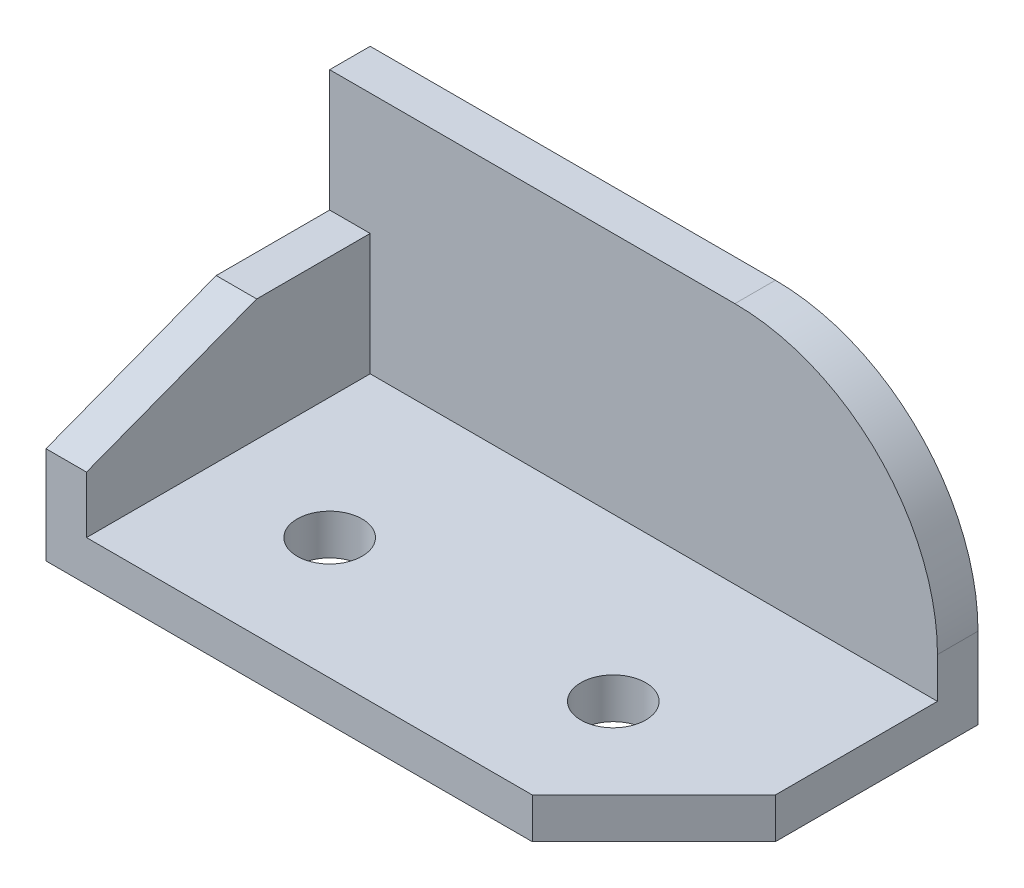
ISO-10303-21;
HEADER;
FILE_DESCRIPTION(('STEP AP214'),'2;1');
FILE_NAME('part.step','',(''),(''),'','','');
FILE_SCHEMA(('AUTOMOTIVE_DESIGN { 1 0 10303 214 1 1 1 1 }'));
ENDSEC;
DATA;
#1=APPLICATION_CONTEXT('core data for automotive mechanical design processes');
#2=APPLICATION_PROTOCOL_DEFINITION('international standard','automotive_design',2000,#1);
#3=PRODUCT_CONTEXT('',#1,'mechanical');
#4=PRODUCT('Part','Part','',(#3));
#5=PRODUCT_RELATED_PRODUCT_CATEGORY('part','',(#4));
#6=PRODUCT_DEFINITION_FORMATION('','',#4);
#7=PRODUCT_DEFINITION_CONTEXT('part definition',#1,'design');
#8=PRODUCT_DEFINITION('design','',#6,#7);
#9=PRODUCT_DEFINITION_SHAPE('','',#8);
#10=(LENGTH_UNIT() NAMED_UNIT(*) SI_UNIT(.MILLI.,.METRE.));
#11=(NAMED_UNIT(*) PLANE_ANGLE_UNIT() SI_UNIT($,.RADIAN.));
#12=(NAMED_UNIT(*) SI_UNIT($,.STERADIAN.) SOLID_ANGLE_UNIT());
#13=UNCERTAINTY_MEASURE_WITH_UNIT(LENGTH_MEASURE(1.E-05),#10,'distance_accuracy_value','');
#14=(GEOMETRIC_REPRESENTATION_CONTEXT(3) GLOBAL_UNCERTAINTY_ASSIGNED_CONTEXT((#13)) GLOBAL_UNIT_ASSIGNED_CONTEXT((#10,
#11,#12)) REPRESENTATION_CONTEXT('',''));
#15=CARTESIAN_POINT('',(0.,0.,0.));
#16=DIRECTION('',(0.,0.,1.));
#17=DIRECTION('',(1.,0.,0.));
#18=AXIS2_PLACEMENT_3D('',#15,#16,#17);
#19=CARTESIAN_POINT('',(75.,0.,5.));
#20=DIRECTION('',(0.,0.,-1.));
#21=DIRECTION('',(0.,1.,0.));
#22=AXIS2_PLACEMENT_3D('',#19,#20,#21);
#23=PLANE('',#22);
#24=DIRECTION('',(0.,-1.,0.));
#25=VECTOR('',#24,1.);
#26=CARTESIAN_POINT('',(75.,0.,5.));
#27=LINE('',#26,#25);
#28=CARTESIAN_POINT('',(75.,10.,5.));
#29=VERTEX_POINT('',#28);
#30=CARTESIAN_POINT('',(75.,5.,5.));
#31=VERTEX_POINT('',#30);
#32=EDGE_CURVE('E243',#29,#31,#27,.T.);
#33=ORIENTED_EDGE('',*,*,#32,.F.);
#34=CARTESIAN_POINT('',(50.,10.,5.));
#35=DIRECTION('',(0.,0.,-1.));
#36=DIRECTION('',(0.,1.,0.));
#37=AXIS2_PLACEMENT_3D('',#34,#35,#36);
#38=CIRCLE('',#37,25.);
#39=CARTESIAN_POINT('',(50.,35.,5.));
#40=VERTEX_POINT('',#39);
#41=EDGE_CURVE('E11',#29,#40,#38,.F.);
#42=ORIENTED_EDGE('',*,*,#41,.T.);
#43=DIRECTION('',(-1.,0.,0.));
#44=VECTOR('',#43,1.);
#45=CARTESIAN_POINT('',(75.,35.,5.));
#46=LINE('',#45,#44);
#47=CARTESIAN_POINT('',(0.,35.,5.));
#48=VERTEX_POINT('',#47);
#49=EDGE_CURVE('E193',#40,#48,#46,.T.);
#50=ORIENTED_EDGE('',*,*,#49,.T.);
#51=DIRECTION('',(0.,-1.,0.));
#52=VECTOR('',#51,1.);
#53=CARTESIAN_POINT('',(0.,0.,5.));
#54=LINE('',#53,#52);
#55=CARTESIAN_POINT('',(0.,20.,5.));
#56=VERTEX_POINT('',#55);
#57=EDGE_CURVE('E229',#48,#56,#54,.T.);
#58=ORIENTED_EDGE('',*,*,#57,.T.);
#59=DIRECTION('',(-1.,0.,0.));
#60=VECTOR('',#59,1.);
#61=CARTESIAN_POINT('',(5.,20.,5.));
#62=LINE('',#61,#60);
#63=CARTESIAN_POINT('',(5.,20.,5.));
#64=VERTEX_POINT('',#63);
#65=EDGE_CURVE('E151',#64,#56,#62,.T.);
#66=ORIENTED_EDGE('',*,*,#65,.F.);
#67=DIRECTION('',(0.,-1.,0.));
#68=VECTOR('',#67,1.);
#69=CARTESIAN_POINT('',(5.,0.,5.));
#70=LINE('',#69,#68);
#71=CARTESIAN_POINT('',(5.,5.,5.));
#72=VERTEX_POINT('',#71);
#73=EDGE_CURVE('E134',#64,#72,#70,.T.);
#74=ORIENTED_EDGE('',*,*,#73,.T.);
#75=DIRECTION('',(-1.,0.,0.));
#76=VECTOR('',#75,1.);
#77=CARTESIAN_POINT('',(75.,5.,5.));
#78=LINE('',#77,#76);
#79=EDGE_CURVE('E149',#31,#72,#78,.T.);
#80=ORIENTED_EDGE('',*,*,#79,.F.);
#81=EDGE_LOOP('',(#33,#42,#50,#58,#66,#74,#80));
#82=FACE_BOUND('',#81,.T.);
#83=ADVANCED_FACE('F47',(#82),#23,.F.);
#84=CARTESIAN_POINT('',(75.,5.,0.));
#85=DIRECTION('',(0.,-1.,0.));
#86=DIRECTION('',(0.,0.,-1.));
#87=AXIS2_PLACEMENT_3D('',#84,#85,#86);
#88=PLANE('',#87);
#89=CARTESIAN_POINT('',(20.,5.,25.));
#90=DIRECTION('',(0.,1.,0.));
#91=DIRECTION('',(0.,0.,1.));
#92=AXIS2_PLACEMENT_3D('',#89,#90,#91);
#93=CIRCLE('',#92,4.00000000000001);
#94=CARTESIAN_POINT('',(20.,5.,29.));
#95=VERTEX_POINT('',#94);
#96=EDGE_CURVE('E287',#95,#95,#93,.T.);
#97=ORIENTED_EDGE('',*,*,#96,.F.);
#98=EDGE_LOOP('',(#97));
#99=FACE_BOUND('',#98,.T.);
#100=CARTESIAN_POINT('',(55.,5.,25.));
#101=DIRECTION('',(0.,1.,0.));
#102=DIRECTION('',(0.,0.,1.));
#103=AXIS2_PLACEMENT_3D('',#100,#101,#102);
#104=CIRCLE('',#103,4.00000000000001);
#105=CARTESIAN_POINT('',(55.,5.,29.));
#106=VERTEX_POINT('',#105);
#107=EDGE_CURVE('E283',#106,#106,#104,.T.);
#108=ORIENTED_EDGE('',*,*,#107,.F.);
#109=EDGE_LOOP('',(#108));
#110=FACE_BOUND('',#109,.T.);
#111=DIRECTION('',(-1.,0.,0.));
#112=VECTOR('',#111,1.);
#113=CARTESIAN_POINT('',(75.,5.,40.));
#114=LINE('',#113,#112);
#115=CARTESIAN_POINT('',(60.,5.,40.));
#116=VERTEX_POINT('',#115);
#117=CARTESIAN_POINT('',(5.,5.,40.));
#118=VERTEX_POINT('',#117);
#119=EDGE_CURVE('E161',#116,#118,#114,.T.);
#120=ORIENTED_EDGE('',*,*,#119,.F.);
#121=DIRECTION('',(-0.707106781186548,0.,0.707106781186548));
#122=VECTOR('',#121,1.);
#123=CARTESIAN_POINT('',(60.,4.99999999999999,40.));
#124=LINE('',#123,#122);
#125=CARTESIAN_POINT('',(75.,5.,25.));
#126=VERTEX_POINT('',#125);
#127=EDGE_CURVE('E167',#116,#126,#124,.F.);
#128=ORIENTED_EDGE('',*,*,#127,.T.);
#129=DIRECTION('',(0.,0.,1.));
#130=VECTOR('',#129,1.);
#131=CARTESIAN_POINT('',(75.,5.,0.));
#132=LINE('',#131,#130);
#133=EDGE_CURVE('E158',#31,#126,#132,.T.);
#134=ORIENTED_EDGE('',*,*,#133,.F.);
#135=ORIENTED_EDGE('',*,*,#79,.T.);
#136=DIRECTION('',(0.,0.,1.));
#137=VECTOR('',#136,1.);
#138=CARTESIAN_POINT('',(5.,5.,0.));
#139=LINE('',#138,#137);
#140=EDGE_CURVE('E133',#72,#118,#139,.T.);
#141=ORIENTED_EDGE('',*,*,#140,.T.);
#142=EDGE_LOOP('',(#120,#128,#134,#135,#141));
#143=FACE_BOUND('',#142,.T.);
#144=ADVANCED_FACE('F156',(#99,#110,#143),#88,.F.);
#145=CARTESIAN_POINT('',(75.,0.,40.));
#146=DIRECTION('',(0.,0.,1.));
#147=DIRECTION('',(1.,0.,0.));
#148=AXIS2_PLACEMENT_3D('',#145,#146,#147);
#149=PLANE('',#148);
#150=DIRECTION('',(-1.,0.,0.));
#151=VECTOR('',#150,1.);
#152=CARTESIAN_POINT('',(75.,0.,40.));
#153=LINE('',#152,#151);
#154=CARTESIAN_POINT('',(60.,0.,40.));
#155=VERTEX_POINT('',#154);
#156=CARTESIAN_POINT('',(0.,0.,40.));
#157=VERTEX_POINT('',#156);
#158=EDGE_CURVE('E169',#155,#157,#153,.T.);
#159=ORIENTED_EDGE('',*,*,#158,.F.);
#160=DIRECTION('',(0.,1.,0.));
#161=VECTOR('',#160,1.);
#162=CARTESIAN_POINT('',(60.,0.,40.));
#163=LINE('',#162,#161);
#164=EDGE_CURVE('E159',#155,#116,#163,.T.);
#165=ORIENTED_EDGE('',*,*,#164,.T.);
#166=ORIENTED_EDGE('',*,*,#119,.T.);
#167=DIRECTION('',(0.,1.,0.));
#168=VECTOR('',#167,1.);
#169=CARTESIAN_POINT('',(5.,0.,40.));
#170=LINE('',#169,#168);
#171=CARTESIAN_POINT('',(5.,12.,40.));
#172=VERTEX_POINT('',#171);
#173=EDGE_CURVE('E137',#118,#172,#170,.T.);
#174=ORIENTED_EDGE('',*,*,#173,.T.);
#175=DIRECTION('',(-1.,0.,0.));
#176=VECTOR('',#175,1.);
#177=CARTESIAN_POINT('',(5.,12.,40.));
#178=LINE('',#177,#176);
#179=CARTESIAN_POINT('',(0.,12.,40.));
#180=VERTEX_POINT('',#179);
#181=EDGE_CURVE('E223',#172,#180,#178,.T.);
#182=ORIENTED_EDGE('',*,*,#181,.T.);
#183=DIRECTION('',(0.,1.,0.));
#184=VECTOR('',#183,1.);
#185=CARTESIAN_POINT('',(0.,0.,40.));
#186=LINE('',#185,#184);
#187=EDGE_CURVE('E224',#157,#180,#186,.T.);
#188=ORIENTED_EDGE('',*,*,#187,.F.);
#189=EDGE_LOOP('',(#159,#165,#166,#174,#182,#188));
#190=FACE_BOUND('',#189,.T.);
#191=ADVANCED_FACE('F221',(#190),#149,.T.);
#192=CARTESIAN_POINT('',(75.,0.,0.));
#193=DIRECTION('',(0.,-1.,0.));
#194=DIRECTION('',(0.,0.,-1.));
#195=AXIS2_PLACEMENT_3D('',#192,#193,#194);
#196=PLANE('',#195);
#197=CARTESIAN_POINT('',(20.,0.,25.));
#198=DIRECTION('',(0.,1.,0.));
#199=DIRECTION('',(0.,0.,1.));
#200=AXIS2_PLACEMENT_3D('',#197,#198,#199);
#201=CIRCLE('',#200,4.00000000000001);
#202=CARTESIAN_POINT('',(20.,0.,29.));
#203=VERTEX_POINT('',#202);
#204=EDGE_CURVE('E284',#203,#203,#201,.T.);
#205=ORIENTED_EDGE('',*,*,#204,.T.);
#206=EDGE_LOOP('',(#205));
#207=FACE_BOUND('',#206,.T.);
#208=CARTESIAN_POINT('',(55.,0.,25.));
#209=DIRECTION('',(0.,1.,0.));
#210=DIRECTION('',(0.,0.,1.));
#211=AXIS2_PLACEMENT_3D('',#208,#209,#210);
#212=CIRCLE('',#211,4.00000000000001);
#213=CARTESIAN_POINT('',(55.,0.,29.));
#214=VERTEX_POINT('',#213);
#215=EDGE_CURVE('E269',#214,#214,#212,.T.);
#216=ORIENTED_EDGE('',*,*,#215,.T.);
#217=EDGE_LOOP('',(#216));
#218=FACE_BOUND('',#217,.T.);
#219=DIRECTION('',(0.,0.,1.));
#220=VECTOR('',#219,1.);
#221=CARTESIAN_POINT('',(75.,0.,0.));
#222=LINE('',#221,#220);
#223=CARTESIAN_POINT('',(75.,0.,0.));
#224=VERTEX_POINT('',#223);
#225=CARTESIAN_POINT('',(75.,0.,25.));
#226=VERTEX_POINT('',#225);
#227=EDGE_CURVE('E244',#224,#226,#222,.T.);
#228=ORIENTED_EDGE('',*,*,#227,.T.);
#229=DIRECTION('',(0.707106781186548,0.,-0.707106781186548));
#230=VECTOR('',#229,1.);
#231=CARTESIAN_POINT('',(87.5,0.,12.5));
#232=LINE('',#231,#230);
#233=EDGE_CURVE('E180',#226,#155,#232,.F.);
#234=ORIENTED_EDGE('',*,*,#233,.T.);
#235=ORIENTED_EDGE('',*,*,#158,.T.);
#236=DIRECTION('',(0.,0.,1.));
#237=VECTOR('',#236,1.);
#238=CARTESIAN_POINT('',(0.,0.,0.));
#239=LINE('',#238,#237);
#240=CARTESIAN_POINT('',(0.,0.,0.));
#241=VERTEX_POINT('',#240);
#242=EDGE_CURVE('E217',#241,#157,#239,.T.);
#243=ORIENTED_EDGE('',*,*,#242,.F.);
#244=DIRECTION('',(-1.,0.,0.));
#245=VECTOR('',#244,1.);
#246=CARTESIAN_POINT('',(75.,0.,0.));
#247=LINE('',#246,#245);
#248=EDGE_CURVE('E203',#224,#241,#247,.T.);
#249=ORIENTED_EDGE('',*,*,#248,.F.);
#250=EDGE_LOOP('',(#228,#234,#235,#243,#249));
#251=FACE_BOUND('',#250,.T.);
#252=ADVANCED_FACE('F214',(#207,#218,#251),#196,.T.);
#253=CARTESIAN_POINT('',(75.,0.,0.));
#254=DIRECTION('',(0.,0.,-1.));
#255=DIRECTION('',(-1.,0.,0.));
#256=AXIS2_PLACEMENT_3D('',#253,#254,#255);
#257=PLANE('',#256);
#258=DIRECTION('',(-1.,0.,0.));
#259=VECTOR('',#258,1.);
#260=CARTESIAN_POINT('',(75.,35.,0.));
#261=LINE('',#260,#259);
#262=CARTESIAN_POINT('',(50.,35.,0.));
#263=VERTEX_POINT('',#262);
#264=CARTESIAN_POINT('',(0.,35.,0.));
#265=VERTEX_POINT('',#264);
#266=EDGE_CURVE('E191',#263,#265,#261,.T.);
#267=ORIENTED_EDGE('',*,*,#266,.F.);
#268=CARTESIAN_POINT('',(50.,10.,0.));
#269=DIRECTION('',(0.,0.,-1.));
#270=DIRECTION('',(-1.,0.,0.));
#271=AXIS2_PLACEMENT_3D('',#268,#269,#270);
#272=CIRCLE('',#271,25.);
#273=CARTESIAN_POINT('',(75.,10.,0.));
#274=VERTEX_POINT('',#273);
#275=EDGE_CURVE('E75',#263,#274,#272,.T.);
#276=ORIENTED_EDGE('',*,*,#275,.T.);
#277=DIRECTION('',(0.,-1.,0.));
#278=VECTOR('',#277,1.);
#279=CARTESIAN_POINT('',(75.,0.,0.));
#280=LINE('',#279,#278);
#281=EDGE_CURVE('E206',#274,#224,#280,.T.);
#282=ORIENTED_EDGE('',*,*,#281,.T.);
#283=ORIENTED_EDGE('',*,*,#248,.T.);
#284=DIRECTION('',(0.,-1.,0.));
#285=VECTOR('',#284,1.);
#286=CARTESIAN_POINT('',(0.,0.,0.));
#287=LINE('',#286,#285);
#288=EDGE_CURVE('E196',#265,#241,#287,.T.);
#289=ORIENTED_EDGE('',*,*,#288,.F.);
#290=EDGE_LOOP('',(#267,#276,#282,#283,#289));
#291=FACE_BOUND('',#290,.T.);
#292=ADVANCED_FACE('F198',(#291),#257,.T.);
#293=CARTESIAN_POINT('',(75.,35.,0.));
#294=DIRECTION('',(0.,1.,0.));
#295=DIRECTION('',(0.,0.,1.));
#296=AXIS2_PLACEMENT_3D('',#293,#294,#295);
#297=PLANE('',#296);
#298=ORIENTED_EDGE('',*,*,#49,.F.);
#299=DIRECTION('',(0.,0.,-1.));
#300=VECTOR('',#299,1.);
#301=CARTESIAN_POINT('',(50.,35.,0.));
#302=LINE('',#301,#300);
#303=EDGE_CURVE('E179',#40,#263,#302,.T.);
#304=ORIENTED_EDGE('',*,*,#303,.T.);
#305=ORIENTED_EDGE('',*,*,#266,.T.);
#306=DIRECTION('',(0.,0.,-1.));
#307=VECTOR('',#306,1.);
#308=CARTESIAN_POINT('',(0.,35.,0.));
#309=LINE('',#308,#307);
#310=EDGE_CURVE('E240',#48,#265,#309,.T.);
#311=ORIENTED_EDGE('',*,*,#310,.F.);
#312=EDGE_LOOP('',(#298,#304,#305,#311));
#313=FACE_BOUND('',#312,.T.);
#314=ADVANCED_FACE('F187',(#313),#297,.T.);
#315=CARTESIAN_POINT('',(75.,0.,0.));
#316=DIRECTION('',(1.,0.,0.));
#317=DIRECTION('',(0.,0.,-1.));
#318=AXIS2_PLACEMENT_3D('',#315,#316,#317);
#319=PLANE('',#318);
#320=ORIENTED_EDGE('',*,*,#281,.F.);
#321=DIRECTION('',(0.,0.,-1.));
#322=VECTOR('',#321,1.);
#323=CARTESIAN_POINT('',(75.,10.,0.));
#324=LINE('',#323,#322);
#325=EDGE_CURVE('E59',#274,#29,#324,.F.);
#326=ORIENTED_EDGE('',*,*,#325,.T.);
#327=ORIENTED_EDGE('',*,*,#32,.T.);
#328=ORIENTED_EDGE('',*,*,#133,.T.);
#329=DIRECTION('',(0.,-1.,0.));
#330=VECTOR('',#329,1.);
#331=CARTESIAN_POINT('',(75.,0.,25.));
#332=LINE('',#331,#330);
#333=EDGE_CURVE('E172',#126,#226,#332,.T.);
#334=ORIENTED_EDGE('',*,*,#333,.T.);
#335=ORIENTED_EDGE('',*,*,#227,.F.);
#336=EDGE_LOOP('',(#320,#326,#327,#328,#334,#335));
#337=FACE_BOUND('',#336,.T.);
#338=ADVANCED_FACE('F332',(#337),#319,.T.);
#339=CARTESIAN_POINT('',(0.,0.,0.));
#340=DIRECTION('',(1.,0.,0.));
#341=DIRECTION('',(0.,0.,-1.));
#342=AXIS2_PLACEMENT_3D('',#339,#340,#341);
#343=PLANE('',#342);
#344=ORIENTED_EDGE('',*,*,#57,.F.);
#345=ORIENTED_EDGE('',*,*,#310,.T.);
#346=ORIENTED_EDGE('',*,*,#288,.T.);
#347=ORIENTED_EDGE('',*,*,#242,.T.);
#348=ORIENTED_EDGE('',*,*,#187,.T.);
#349=DIRECTION('',(0.,0.355995327591988,-0.934487734928968));
#350=VECTOR('',#349,1.);
#351=CARTESIAN_POINT('',(0.,23.7861386138614,9.06138613861386));
#352=LINE('',#351,#350);
#353=CARTESIAN_POINT('',(0.,20.,19.));
#354=VERTEX_POINT('',#353);
#355=EDGE_CURVE('E145',#180,#354,#352,.T.);
#356=ORIENTED_EDGE('',*,*,#355,.T.);
#357=DIRECTION('',(0.,0.,-1.));
#358=VECTOR('',#357,1.);
#359=CARTESIAN_POINT('',(0.,20.,0.));
#360=LINE('',#359,#358);
#361=EDGE_CURVE('E270',#354,#56,#360,.T.);
#362=ORIENTED_EDGE('',*,*,#361,.T.);
#363=EDGE_LOOP('',(#344,#345,#346,#347,#348,#356,#362));
#364=FACE_BOUND('',#363,.T.);
#365=ADVANCED_FACE('F233',(#364),#343,.F.);
#366=CARTESIAN_POINT('',(5.,20.,0.));
#367=DIRECTION('',(0.,1.,0.));
#368=DIRECTION('',(0.,0.,1.));
#369=AXIS2_PLACEMENT_3D('',#366,#367,#368);
#370=PLANE('',#369);
#371=ORIENTED_EDGE('',*,*,#361,.F.);
#372=DIRECTION('',(-1.,0.,0.));
#373=VECTOR('',#372,1.);
#374=CARTESIAN_POINT('',(5.,20.,19.));
#375=LINE('',#374,#373);
#376=CARTESIAN_POINT('',(5.,20.,19.));
#377=VERTEX_POINT('',#376);
#378=EDGE_CURVE('E254',#377,#354,#375,.T.);
#379=ORIENTED_EDGE('',*,*,#378,.F.);
#380=DIRECTION('',(0.,0.,-1.));
#381=VECTOR('',#380,1.);
#382=CARTESIAN_POINT('',(5.,20.,0.));
#383=LINE('',#382,#381);
#384=EDGE_CURVE('E153',#377,#64,#383,.T.);
#385=ORIENTED_EDGE('',*,*,#384,.T.);
#386=ORIENTED_EDGE('',*,*,#65,.T.);
#387=EDGE_LOOP('',(#371,#379,#385,#386));
#388=FACE_BOUND('',#387,.T.);
#389=ADVANCED_FACE('F334',(#388),#370,.T.);
#390=CARTESIAN_POINT('',(5.,23.7861386138614,9.06138613861386));
#391=DIRECTION('',(0.,0.934487734928968,0.355995327591988));
#392=DIRECTION('',(0.,-0.355995327591988,0.934487734928968));
#393=AXIS2_PLACEMENT_3D('',#390,#391,#392);
#394=PLANE('',#393);
#395=ORIENTED_EDGE('',*,*,#355,.F.);
#396=ORIENTED_EDGE('',*,*,#181,.F.);
#397=DIRECTION('',(0.,0.355995327591988,-0.934487734928968));
#398=VECTOR('',#397,1.);
#399=CARTESIAN_POINT('',(5.,23.7861386138614,9.06138613861386));
#400=LINE('',#399,#398);
#401=EDGE_CURVE('E272',#172,#377,#400,.T.);
#402=ORIENTED_EDGE('',*,*,#401,.T.);
#403=ORIENTED_EDGE('',*,*,#378,.T.);
#404=EDGE_LOOP('',(#395,#396,#402,#403));
#405=FACE_BOUND('',#404,.T.);
#406=ADVANCED_FACE('F315',(#405),#394,.T.);
#407=CARTESIAN_POINT('',(5.,0.,0.));
#408=DIRECTION('',(1.,0.,0.));
#409=DIRECTION('',(0.,0.,-1.));
#410=AXIS2_PLACEMENT_3D('',#407,#408,#409);
#411=PLANE('',#410);
#412=ORIENTED_EDGE('',*,*,#140,.F.);
#413=ORIENTED_EDGE('',*,*,#73,.F.);
#414=ORIENTED_EDGE('',*,*,#384,.F.);
#415=ORIENTED_EDGE('',*,*,#401,.F.);
#416=ORIENTED_EDGE('',*,*,#173,.F.);
#417=EDGE_LOOP('',(#412,#413,#414,#415,#416));
#418=FACE_BOUND('',#417,.T.);
#419=ADVANCED_FACE('F131',(#418),#411,.T.);
#420=CARTESIAN_POINT('',(55.,5.,25.));
#421=DIRECTION('',(0.,1.,0.));
#422=DIRECTION('',(0.,0.,1.));
#423=AXIS2_PLACEMENT_3D('',#420,#421,#422);
#424=CYLINDRICAL_SURFACE('',#423,4.00000000000001);
#425=ORIENTED_EDGE('',*,*,#215,.F.);
#426=EDGE_LOOP('',(#425));
#427=FACE_BOUND('',#426,.T.);
#428=ORIENTED_EDGE('',*,*,#107,.T.);
#429=EDGE_LOOP('',(#428));
#430=FACE_BOUND('',#429,.T.);
#431=ADVANCED_FACE('F301',(#427,#430),#424,.F.);
#432=CARTESIAN_POINT('',(20.,5.,25.));
#433=DIRECTION('',(0.,1.,0.));
#434=DIRECTION('',(0.,0.,1.));
#435=AXIS2_PLACEMENT_3D('',#432,#433,#434);
#436=CYLINDRICAL_SURFACE('',#435,4.00000000000001);
#437=ORIENTED_EDGE('',*,*,#204,.F.);
#438=EDGE_LOOP('',(#437));
#439=FACE_BOUND('',#438,.T.);
#440=ORIENTED_EDGE('',*,*,#96,.T.);
#441=EDGE_LOOP('',(#440));
#442=FACE_BOUND('',#441,.T.);
#443=ADVANCED_FACE('F294',(#439,#442),#436,.F.);
#444=CARTESIAN_POINT('',(60.,0.,40.));
#445=DIRECTION('',(-0.707106781186547,0.,-0.707106781186547));
#446=DIRECTION('',(0.,1.,0.));
#447=AXIS2_PLACEMENT_3D('',#444,#445,#446);
#448=PLANE('',#447);
#449=ORIENTED_EDGE('',*,*,#233,.F.);
#450=ORIENTED_EDGE('',*,*,#333,.F.);
#451=ORIENTED_EDGE('',*,*,#127,.F.);
#452=ORIENTED_EDGE('',*,*,#164,.F.);
#453=EDGE_LOOP('',(#449,#450,#451,#452));
#454=FACE_BOUND('',#453,.T.);
#455=ADVANCED_FACE('F310',(#454),#448,.F.);
#456=CARTESIAN_POINT('',(50.,10.,0.));
#457=DIRECTION('',(0.,0.,-1.));
#458=DIRECTION('',(-1.,0.,0.));
#459=AXIS2_PLACEMENT_3D('',#456,#457,#458);
#460=CYLINDRICAL_SURFACE('',#459,25.);
#461=ORIENTED_EDGE('',*,*,#41,.F.);
#462=ORIENTED_EDGE('',*,*,#325,.F.);
#463=ORIENTED_EDGE('',*,*,#275,.F.);
#464=ORIENTED_EDGE('',*,*,#303,.F.);
#465=EDGE_LOOP('',(#461,#462,#463,#464));
#466=FACE_BOUND('',#465,.T.);
#467=ADVANCED_FACE('F51',(#466),#460,.T.);
#468=CLOSED_SHELL('',(#83,#144,#191,#252,#292,#314,#338,#365,#389,#406,#419,#431,#443,#455,#467));
#469=MANIFOLD_SOLID_BREP('B2',#468);
#470=ADVANCED_BREP_SHAPE_REPRESENTATION('',(#18,#469),#14);
#471=SHAPE_DEFINITION_REPRESENTATION(#9,#470);
ENDSEC;
END-ISO-10303-21;
